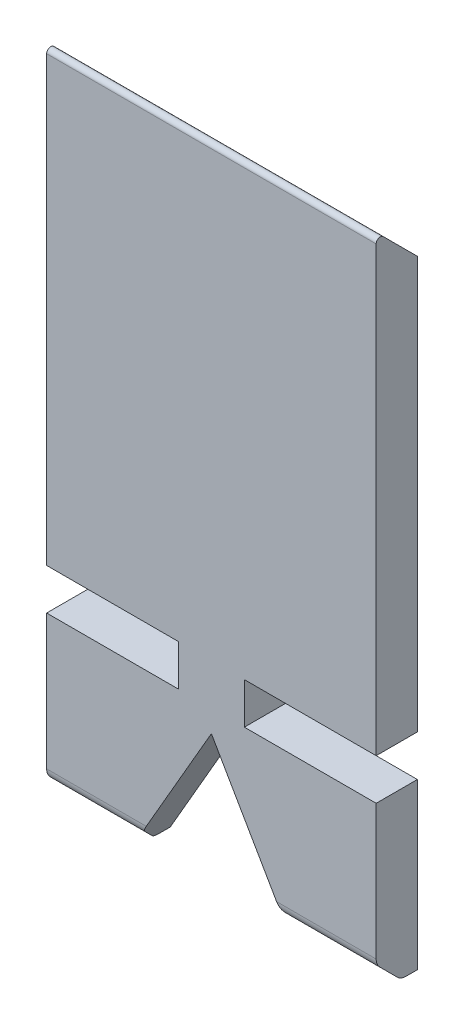
ISO-10303-21;
HEADER;
FILE_DESCRIPTION(('STEP AP214'),'2;1');
FILE_NAME('part.step','',(''),(''),'','','');
FILE_SCHEMA(('AUTOMOTIVE_DESIGN { 1 0 10303 214 1 1 1 1 }'));
ENDSEC;
DATA;
#1=APPLICATION_CONTEXT('core data for automotive mechanical design processes');
#2=APPLICATION_PROTOCOL_DEFINITION('international standard','automotive_design',2000,#1);
#3=PRODUCT_CONTEXT('',#1,'mechanical');
#4=PRODUCT('Part','Part','',(#3));
#5=PRODUCT_RELATED_PRODUCT_CATEGORY('part','',(#4));
#6=PRODUCT_DEFINITION_FORMATION('','',#4);
#7=PRODUCT_DEFINITION_CONTEXT('part definition',#1,'design');
#8=PRODUCT_DEFINITION('design','',#6,#7);
#9=PRODUCT_DEFINITION_SHAPE('','',#8);
#10=(LENGTH_UNIT() NAMED_UNIT(*) SI_UNIT(.MILLI.,.METRE.));
#11=(NAMED_UNIT(*) PLANE_ANGLE_UNIT() SI_UNIT($,.RADIAN.));
#12=(NAMED_UNIT(*) SI_UNIT($,.STERADIAN.) SOLID_ANGLE_UNIT());
#13=UNCERTAINTY_MEASURE_WITH_UNIT(LENGTH_MEASURE(1.E-05),#10,'distance_accuracy_value','');
#14=(GEOMETRIC_REPRESENTATION_CONTEXT(3) GLOBAL_UNCERTAINTY_ASSIGNED_CONTEXT((#13)) GLOBAL_UNIT_ASSIGNED_CONTEXT((#10,
#11,#12)) REPRESENTATION_CONTEXT('',''));
#15=CARTESIAN_POINT('',(0.,0.,0.));
#16=DIRECTION('',(0.,0.,1.));
#17=DIRECTION('',(1.,0.,0.));
#18=AXIS2_PLACEMENT_3D('',#15,#16,#17);
#19=CARTESIAN_POINT('',(0.,0.,10.));
#20=DIRECTION('',(1.,0.,0.));
#21=DIRECTION('',(0.,0.,-1.));
#22=AXIS2_PLACEMENT_3D('',#19,#20,#21);
#23=PLANE('',#22);
#24=DIRECTION('',(0.,-1.,0.));
#25=VECTOR('',#24,1.);
#26=CARTESIAN_POINT('',(0.,0.,0.));
#27=LINE('',#26,#25);
#28=CARTESIAN_POINT('',(0.,150.,0.));
#29=VERTEX_POINT('',#28);
#30=CARTESIAN_POINT('',(0.,50.,0.));
#31=VERTEX_POINT('',#30);
#32=EDGE_CURVE('E332',#29,#31,#27,.T.);
#33=ORIENTED_EDGE('',*,*,#32,.T.);
#34=DIRECTION('',(0.,0.,1.));
#35=VECTOR('',#34,1.);
#36=CARTESIAN_POINT('',(0.,50.,0.));
#37=LINE('',#36,#35);
#38=CARTESIAN_POINT('',(0.,50.,10.));
#39=VERTEX_POINT('',#38);
#40=EDGE_CURVE('E252',#31,#39,#37,.T.);
#41=ORIENTED_EDGE('',*,*,#40,.T.);
#42=DIRECTION('',(0.,-1.,0.));
#43=VECTOR('',#42,1.);
#44=CARTESIAN_POINT('',(0.,0.,10.));
#45=LINE('',#44,#43);
#46=CARTESIAN_POINT('',(0.,157.585786437627,10.));
#47=VERTEX_POINT('',#46);
#48=EDGE_CURVE('E321',#47,#39,#45,.T.);
#49=ORIENTED_EDGE('',*,*,#48,.F.);
#50=CARTESIAN_POINT('',(0.,157.585786437627,9.));
#51=DIRECTION('',(1.,0.,0.));
#52=DIRECTION('',(0.,0.,-1.));
#53=AXIS2_PLACEMENT_3D('',#50,#51,#52);
#54=CIRCLE('',#53,1.);
#55=CARTESIAN_POINT('',(0.,158.292893218813,8.29289321881344));
#56=VERTEX_POINT('',#55);
#57=EDGE_CURVE('E407',#47,#56,#54,.F.);
#58=ORIENTED_EDGE('',*,*,#57,.T.);
#59=DIRECTION('',(0.,-0.707106781186549,-0.707106781186547));
#60=VECTOR('',#59,1.);
#61=CARTESIAN_POINT('',(0.,160.,10.));
#62=LINE('',#61,#60);
#63=EDGE_CURVE('E351',#56,#29,#62,.T.);
#64=ORIENTED_EDGE('',*,*,#63,.T.);
#65=EDGE_LOOP('',(#33,#41,#49,#58,#64));
#66=FACE_BOUND('',#65,.T.);
#67=ADVANCED_FACE('F53',(#66),#23,.F.);
#68=CARTESIAN_POINT('',(0.,0.,10.));
#69=DIRECTION('',(0.,1.,0.));
#70=DIRECTION('',(0.,0.,1.));
#71=AXIS2_PLACEMENT_3D('',#68,#69,#70);
#72=PLANE('',#71);
#73=DIRECTION('',(1.,0.,0.));
#74=VECTOR('',#73,1.);
#75=CARTESIAN_POINT('',(0.,0.,2.75735931288071));
#76=LINE('',#75,#74);
#77=CARTESIAN_POINT('',(80.,0.,2.75735931288071));
#78=VERTEX_POINT('',#77);
#79=CARTESIAN_POINT('',(60.,0.,2.75735931288071));
#80=VERTEX_POINT('',#79);
#81=EDGE_CURVE('E371',#78,#80,#76,.F.);
#82=ORIENTED_EDGE('',*,*,#81,.T.);
#83=DIRECTION('',(0.,0.,1.));
#84=VECTOR('',#83,1.);
#85=CARTESIAN_POINT('',(60.,0.,0.));
#86=LINE('',#85,#84);
#87=CARTESIAN_POINT('',(60.,0.,0.));
#88=VERTEX_POINT('',#87);
#89=EDGE_CURVE('E236',#88,#80,#86,.T.);
#90=ORIENTED_EDGE('',*,*,#89,.F.);
#91=DIRECTION('',(1.,0.,0.));
#92=VECTOR('',#91,1.);
#93=CARTESIAN_POINT('',(0.,0.,0.));
#94=LINE('',#93,#92);
#95=CARTESIAN_POINT('',(80.,0.,0.));
#96=VERTEX_POINT('',#95);
#97=EDGE_CURVE('E226',#88,#96,#94,.T.);
#98=ORIENTED_EDGE('',*,*,#97,.T.);
#99=DIRECTION('',(0.,0.,-1.));
#100=VECTOR('',#99,1.);
#101=CARTESIAN_POINT('',(80.,0.,10.));
#102=LINE('',#101,#100);
#103=EDGE_CURVE('E331',#78,#96,#102,.T.);
#104=ORIENTED_EDGE('',*,*,#103,.F.);
#105=EDGE_LOOP('',(#82,#90,#98,#104));
#106=FACE_BOUND('',#105,.T.);
#107=ADVANCED_FACE('F492',(#106),#72,.F.);
#108=CARTESIAN_POINT('',(80.,0.,10.));
#109=DIRECTION('',(-1.,0.,0.));
#110=DIRECTION('',(0.,0.,1.));
#111=AXIS2_PLACEMENT_3D('',#108,#109,#110);
#112=PLANE('',#111);
#113=DIRECTION('',(0.,1.,0.));
#114=VECTOR('',#113,1.);
#115=CARTESIAN_POINT('',(80.,0.,0.));
#116=LINE('',#115,#114);
#117=CARTESIAN_POINT('',(80.,40.,0.));
#118=VERTEX_POINT('',#117);
#119=EDGE_CURVE('E340',#96,#118,#116,.T.);
#120=ORIENTED_EDGE('',*,*,#119,.T.);
#121=DIRECTION('',(0.,0.,1.));
#122=VECTOR('',#121,1.);
#123=CARTESIAN_POINT('',(80.,40.,0.));
#124=LINE('',#123,#122);
#125=CARTESIAN_POINT('',(80.,40.,10.));
#126=VERTEX_POINT('',#125);
#127=EDGE_CURVE('E286',#118,#126,#124,.T.);
#128=ORIENTED_EDGE('',*,*,#127,.T.);
#129=DIRECTION('',(0.,1.,0.));
#130=VECTOR('',#129,1.);
#131=CARTESIAN_POINT('',(80.,0.,10.));
#132=LINE('',#131,#130);
#133=CARTESIAN_POINT('',(80.,7.24264068711929,10.));
#134=VERTEX_POINT('',#133);
#135=EDGE_CURVE('E327',#134,#126,#132,.T.);
#136=ORIENTED_EDGE('',*,*,#135,.F.);
#137=CARTESIAN_POINT('',(80.,7.24264068711929,7.));
#138=DIRECTION('',(-1.,0.,0.));
#139=DIRECTION('',(0.,0.,1.));
#140=AXIS2_PLACEMENT_3D('',#137,#138,#139);
#141=CIRCLE('',#140,3.);
#142=CARTESIAN_POINT('',(80.,5.12132034355964,9.12132034355965));
#143=VERTEX_POINT('',#142);
#144=EDGE_CURVE('E391',#134,#143,#141,.F.);
#145=ORIENTED_EDGE('',*,*,#144,.T.);
#146=DIRECTION('',(0.,0.707106781186548,0.707106781186548));
#147=VECTOR('',#146,1.);
#148=CARTESIAN_POINT('',(80.,6.,10.));
#149=LINE('',#148,#147);
#150=CARTESIAN_POINT('',(80.,0.878679656440356,4.87867965644036));
#151=VERTEX_POINT('',#150);
#152=EDGE_CURVE('E362',#143,#151,#149,.F.);
#153=ORIENTED_EDGE('',*,*,#152,.T.);
#154=CARTESIAN_POINT('',(80.,3.,2.75735931288071));
#155=DIRECTION('',(-1.,0.,0.));
#156=DIRECTION('',(0.,0.,1.));
#157=AXIS2_PLACEMENT_3D('',#154,#155,#156);
#158=CIRCLE('',#157,3.);
#159=EDGE_CURVE('E383',#151,#78,#158,.F.);
#160=ORIENTED_EDGE('',*,*,#159,.T.);
#161=ORIENTED_EDGE('',*,*,#103,.T.);
#162=EDGE_LOOP('',(#120,#128,#136,#145,#153,#160,#161));
#163=FACE_BOUND('',#162,.T.);
#164=ADVANCED_FACE('F487',(#163),#112,.F.);
#165=CARTESIAN_POINT('',(0.,6.,10.));
#166=DIRECTION('',(0.,0.707106781186548,-0.707106781186548));
#167=DIRECTION('',(1.,0.,0.));
#168=AXIS2_PLACEMENT_3D('',#165,#166,#167);
#169=PLANE('',#168);
#170=DIRECTION('',(0.377964473009227,-0.654653670707977,-0.654653670707977));
#171=VECTOR('',#170,1.);
#172=CARTESIAN_POINT('',(48.4593414727391,19.9890069220189,23.9890069220189));
#173=LINE('',#172,#171);
#174=CARTESIAN_POINT('',(59.4926940638227,0.878679656440354,4.87867965644035));
#175=VERTEX_POINT('',#174);
#176=CARTESIAN_POINT('',(57.0432043210395,5.12132034355964,9.12132034355964));
#177=VERTEX_POINT('',#176);
#178=EDGE_CURVE('E314',#175,#177,#173,.F.);
#179=ORIENTED_EDGE('',*,*,#178,.F.);
#180=DIRECTION('',(-1.,0.,0.));
#181=VECTOR('',#180,1.);
#182=CARTESIAN_POINT('',(80.,0.878679656440357,4.87867965644036));
#183=LINE('',#182,#181);
#184=EDGE_CURVE('E378',#175,#151,#183,.F.);
#185=ORIENTED_EDGE('',*,*,#184,.T.);
#186=ORIENTED_EDGE('',*,*,#152,.F.);
#187=DIRECTION('',(1.,0.,0.));
#188=VECTOR('',#187,1.);
#189=CARTESIAN_POINT('',(0.,5.12132034355964,9.12132034355964));
#190=LINE('',#189,#188);
#191=EDGE_CURVE('E395',#143,#177,#190,.F.);
#192=ORIENTED_EDGE('',*,*,#191,.T.);
#193=EDGE_LOOP('',(#179,#185,#186,#192));
#194=FACE_BOUND('',#193,.T.);
#195=ADVANCED_FACE('F500',(#194),#169,.F.);
#196=CARTESIAN_POINT('',(0.,3.,2.75735931288071));
#197=DIRECTION('',(-1.,0.,0.));
#198=DIRECTION('',(0.,0.,1.));
#199=AXIS2_PLACEMENT_3D('',#196,#197,#198);
#200=CYLINDRICAL_SURFACE('',#199,3.);
#201=CARTESIAN_POINT('',(58.2679491924311,3.,2.75735931288071));
#202=DIRECTION('',(0.866025403784439,0.5,0.));
#203=DIRECTION('',(-0.5,0.866025403784439,0.));
#204=AXIS2_PLACEMENT_3D('',#201,#202,#203);
#205=ELLIPSE('',#204,3.46410161513775,3.);
#206=EDGE_CURVE('E317',#80,#175,#205,.F.);
#207=ORIENTED_EDGE('',*,*,#206,.F.);
#208=ORIENTED_EDGE('',*,*,#81,.F.);
#209=ORIENTED_EDGE('',*,*,#159,.F.);
#210=ORIENTED_EDGE('',*,*,#184,.F.);
#211=EDGE_LOOP('',(#207,#208,#209,#210));
#212=FACE_BOUND('',#211,.T.);
#213=ADVANCED_FACE('F495',(#212),#200,.T.);
#214=CARTESIAN_POINT('',(0.,7.24264068711929,7.));
#215=DIRECTION('',(1.,0.,0.));
#216=DIRECTION('',(0.,0.,-1.));
#217=AXIS2_PLACEMENT_3D('',#214,#215,#216);
#218=CYLINDRICAL_SURFACE('',#217,3.);
#219=CARTESIAN_POINT('',(55.8184594496479,7.24264068711929,7.));
#220=DIRECTION('',(0.866025403784439,0.5,0.));
#221=DIRECTION('',(0.5,-0.866025403784439,0.));
#222=AXIS2_PLACEMENT_3D('',#219,#220,#221);
#223=ELLIPSE('',#222,3.46410161513775,3.);
#224=CARTESIAN_POINT('',(55.8184594496479,7.24264068711929,10.));
#225=VERTEX_POINT('',#224);
#226=EDGE_CURVE('E13',#177,#225,#223,.F.);
#227=ORIENTED_EDGE('',*,*,#226,.F.);
#228=ORIENTED_EDGE('',*,*,#191,.F.);
#229=ORIENTED_EDGE('',*,*,#144,.F.);
#230=DIRECTION('',(-1.,0.,0.));
#231=VECTOR('',#230,1.);
#232=CARTESIAN_POINT('',(80.,7.24264068711929,10.));
#233=LINE('',#232,#231);
#234=EDGE_CURVE('E386',#225,#134,#233,.F.);
#235=ORIENTED_EDGE('',*,*,#234,.F.);
#236=EDGE_LOOP('',(#227,#228,#229,#235));
#237=FACE_BOUND('',#236,.T.);
#238=ADVANCED_FACE('F505',(#237),#218,.T.);
#239=CARTESIAN_POINT('',(0.,40.,10.));
#240=VERTEX_POINT('',#239);
#241=CARTESIAN_POINT('',(0.,7.24264068711929,10.));
#242=VERTEX_POINT('',#241);
#243=EDGE_CURVE('E326',#240,#242,#45,.T.);
#244=ORIENTED_EDGE('',*,*,#243,.F.);
#245=DIRECTION('',(0.,0.,1.));
#246=VECTOR('',#245,1.);
#247=CARTESIAN_POINT('',(0.,40.,0.));
#248=LINE('',#247,#246);
#249=CARTESIAN_POINT('',(0.,40.,0.));
#250=VERTEX_POINT('',#249);
#251=EDGE_CURVE('E242',#250,#240,#248,.T.);
#252=ORIENTED_EDGE('',*,*,#251,.F.);
#253=CARTESIAN_POINT('',(0.,0.,0.));
#254=VERTEX_POINT('',#253);
#255=EDGE_CURVE('E320',#250,#254,#27,.T.);
#256=ORIENTED_EDGE('',*,*,#255,.T.);
#257=DIRECTION('',(0.,0.,-1.));
#258=VECTOR('',#257,1.);
#259=CARTESIAN_POINT('',(0.,0.,10.));
#260=LINE('',#259,#258);
#261=CARTESIAN_POINT('',(0.,0.,2.75735931288071));
#262=VERTEX_POINT('',#261);
#263=EDGE_CURVE('E347',#262,#254,#260,.T.);
#264=ORIENTED_EDGE('',*,*,#263,.F.);
#265=CARTESIAN_POINT('',(0.,3.,2.75735931288071));
#266=DIRECTION('',(1.,0.,0.));
#267=DIRECTION('',(0.,0.,-1.));
#268=AXIS2_PLACEMENT_3D('',#265,#266,#267);
#269=CIRCLE('',#268,3.);
#270=CARTESIAN_POINT('',(0.,0.878679656440356,4.87867965644036));
#271=VERTEX_POINT('',#270);
#272=EDGE_CURVE('E375',#262,#271,#269,.F.);
#273=ORIENTED_EDGE('',*,*,#272,.T.);
#274=DIRECTION('',(0.,-0.707106781186548,-0.707106781186548));
#275=VECTOR('',#274,1.);
#276=CARTESIAN_POINT('',(0.,6.,10.));
#277=LINE('',#276,#275);
#278=CARTESIAN_POINT('',(0.,5.12132034355964,9.12132034355965));
#279=VERTEX_POINT('',#278);
#280=EDGE_CURVE('E366',#271,#279,#277,.F.);
#281=ORIENTED_EDGE('',*,*,#280,.T.);
#282=CARTESIAN_POINT('',(0.,7.24264068711929,7.));
#283=DIRECTION('',(1.,0.,0.));
#284=DIRECTION('',(0.,0.,-1.));
#285=AXIS2_PLACEMENT_3D('',#282,#283,#284);
#286=CIRCLE('',#285,3.);
#287=EDGE_CURVE('E399',#279,#242,#286,.F.);
#288=ORIENTED_EDGE('',*,*,#287,.T.);
#289=EDGE_LOOP('',(#244,#252,#256,#264,#273,#281,#288));
#290=FACE_BOUND('',#289,.T.);
#291=ADVANCED_FACE('F443',(#290),#23,.F.);
#292=CARTESIAN_POINT('',(20.,0.,0.));
#293=VERTEX_POINT('',#292);
#294=EDGE_CURVE('E336',#254,#293,#94,.T.);
#295=ORIENTED_EDGE('',*,*,#294,.T.);
#296=DIRECTION('',(0.,0.,1.));
#297=VECTOR('',#296,1.);
#298=CARTESIAN_POINT('',(20.,0.,0.));
#299=LINE('',#298,#297);
#300=CARTESIAN_POINT('',(20.,0.,2.75735931288071));
#301=VERTEX_POINT('',#300);
#302=EDGE_CURVE('E212',#293,#301,#299,.T.);
#303=ORIENTED_EDGE('',*,*,#302,.T.);
#304=EDGE_CURVE('E370',#301,#262,#76,.F.);
#305=ORIENTED_EDGE('',*,*,#304,.T.);
#306=ORIENTED_EDGE('',*,*,#263,.T.);
#307=EDGE_LOOP('',(#295,#303,#305,#306));
#308=FACE_BOUND('',#307,.T.);
#309=ADVANCED_FACE('F445',(#308),#72,.F.);
#310=CARTESIAN_POINT('',(80.,50.,10.));
#311=VERTEX_POINT('',#310);
#312=CARTESIAN_POINT('',(80.,157.585786437627,10.));
#313=VERTEX_POINT('',#312);
#314=EDGE_CURVE('E325',#311,#313,#132,.T.);
#315=ORIENTED_EDGE('',*,*,#314,.F.);
#316=DIRECTION('',(0.,0.,1.));
#317=VECTOR('',#316,1.);
#318=CARTESIAN_POINT('',(80.,50.,0.));
#319=LINE('',#318,#317);
#320=CARTESIAN_POINT('',(80.,50.,0.));
#321=VERTEX_POINT('',#320);
#322=EDGE_CURVE('E276',#321,#311,#319,.T.);
#323=ORIENTED_EDGE('',*,*,#322,.F.);
#324=CARTESIAN_POINT('',(80.,150.,0.));
#325=VERTEX_POINT('',#324);
#326=EDGE_CURVE('E339',#321,#325,#116,.T.);
#327=ORIENTED_EDGE('',*,*,#326,.T.);
#328=DIRECTION('',(0.,0.707106781186549,0.707106781186547));
#329=VECTOR('',#328,1.);
#330=CARTESIAN_POINT('',(80.,160.,10.));
#331=LINE('',#330,#329);
#332=CARTESIAN_POINT('',(80.,158.292893218813,8.29289321881344));
#333=VERTEX_POINT('',#332);
#334=EDGE_CURVE('E358',#325,#333,#331,.T.);
#335=ORIENTED_EDGE('',*,*,#334,.T.);
#336=CARTESIAN_POINT('',(80.,157.585786437627,9.));
#337=DIRECTION('',(-1.,0.,0.));
#338=DIRECTION('',(0.,0.,1.));
#339=AXIS2_PLACEMENT_3D('',#336,#337,#338);
#340=CIRCLE('',#339,1.);
#341=EDGE_CURVE('E413',#333,#313,#340,.F.);
#342=ORIENTED_EDGE('',*,*,#341,.T.);
#343=EDGE_LOOP('',(#315,#323,#327,#335,#342));
#344=FACE_BOUND('',#343,.T.);
#345=ADVANCED_FACE('F473',(#344),#112,.F.);
#346=CARTESIAN_POINT('',(0.,0.,10.));
#347=DIRECTION('',(0.,0.,-1.));
#348=DIRECTION('',(-1.,0.,0.));
#349=AXIS2_PLACEMENT_3D('',#346,#347,#348);
#350=PLANE('',#349);
#351=DIRECTION('',(-0.5,-0.866025403784439,0.));
#352=VECTOR('',#351,1.);
#353=CARTESIAN_POINT('',(40.,34.6410161513776,10.));
#354=LINE('',#353,#352);
#355=CARTESIAN_POINT('',(40.,34.6410161513776,10.));
#356=VERTEX_POINT('',#355);
#357=CARTESIAN_POINT('',(24.1815405503521,7.24264068711929,10.));
#358=VERTEX_POINT('',#357);
#359=EDGE_CURVE('E228',#356,#358,#354,.T.);
#360=ORIENTED_EDGE('',*,*,#359,.F.);
#361=DIRECTION('',(-0.5,0.866025403784439,0.));
#362=VECTOR('',#361,1.);
#363=CARTESIAN_POINT('',(60.,0.,10.));
#364=LINE('',#363,#362);
#365=EDGE_CURVE('E208',#225,#356,#364,.T.);
#366=ORIENTED_EDGE('',*,*,#365,.F.);
#367=ORIENTED_EDGE('',*,*,#234,.T.);
#368=ORIENTED_EDGE('',*,*,#135,.T.);
#369=DIRECTION('',(1.,0.,0.));
#370=VECTOR('',#369,1.);
#371=CARTESIAN_POINT('',(80.,40.,10.));
#372=LINE('',#371,#370);
#373=CARTESIAN_POINT('',(48.,40.,10.));
#374=VERTEX_POINT('',#373);
#375=EDGE_CURVE('E290',#374,#126,#372,.T.);
#376=ORIENTED_EDGE('',*,*,#375,.F.);
#377=DIRECTION('',(0.,-1.,0.));
#378=VECTOR('',#377,1.);
#379=CARTESIAN_POINT('',(48.,50.,10.));
#380=LINE('',#379,#378);
#381=CARTESIAN_POINT('',(48.,50.,10.));
#382=VERTEX_POINT('',#381);
#383=EDGE_CURVE('E293',#382,#374,#380,.T.);
#384=ORIENTED_EDGE('',*,*,#383,.F.);
#385=DIRECTION('',(-1.,0.,0.));
#386=VECTOR('',#385,1.);
#387=CARTESIAN_POINT('',(80.,50.,10.));
#388=LINE('',#387,#386);
#389=EDGE_CURVE('E256',#311,#382,#388,.T.);
#390=ORIENTED_EDGE('',*,*,#389,.F.);
#391=ORIENTED_EDGE('',*,*,#314,.T.);
#392=DIRECTION('',(-1.,0.,0.));
#393=VECTOR('',#392,1.);
#394=CARTESIAN_POINT('',(0.,157.585786437627,10.));
#395=LINE('',#394,#393);
#396=EDGE_CURVE('E403',#313,#47,#395,.T.);
#397=ORIENTED_EDGE('',*,*,#396,.T.);
#398=ORIENTED_EDGE('',*,*,#48,.T.);
#399=DIRECTION('',(-1.,0.,0.));
#400=VECTOR('',#399,1.);
#401=CARTESIAN_POINT('',(0.,50.,10.));
#402=LINE('',#401,#400);
#403=CARTESIAN_POINT('',(32.,50.,10.));
#404=VERTEX_POINT('',#403);
#405=EDGE_CURVE('E257',#404,#39,#402,.T.);
#406=ORIENTED_EDGE('',*,*,#405,.F.);
#407=DIRECTION('',(0.,1.,0.));
#408=VECTOR('',#407,1.);
#409=CARTESIAN_POINT('',(32.,50.,10.));
#410=LINE('',#409,#408);
#411=CARTESIAN_POINT('',(32.,40.,10.));
#412=VERTEX_POINT('',#411);
#413=EDGE_CURVE('E260',#412,#404,#410,.T.);
#414=ORIENTED_EDGE('',*,*,#413,.F.);
#415=DIRECTION('',(1.,0.,0.));
#416=VECTOR('',#415,1.);
#417=CARTESIAN_POINT('',(0.,40.,10.));
#418=LINE('',#417,#416);
#419=EDGE_CURVE('E234',#240,#412,#418,.T.);
#420=ORIENTED_EDGE('',*,*,#419,.F.);
#421=ORIENTED_EDGE('',*,*,#243,.T.);
#422=EDGE_CURVE('E387',#242,#358,#233,.F.);
#423=ORIENTED_EDGE('',*,*,#422,.T.);
#424=EDGE_LOOP('',(#360,#366,#367,#368,#376,#384,#390,#391,#397,#398,#406,#414,#420,#421,#423));
#425=FACE_BOUND('',#424,.T.);
#426=ADVANCED_FACE('F451',(#425),#350,.F.);
#427=CARTESIAN_POINT('',(0.,0.,0.));
#428=DIRECTION('',(0.,0.,-1.));
#429=DIRECTION('',(-1.,0.,0.));
#430=AXIS2_PLACEMENT_3D('',#427,#428,#429);
#431=PLANE('',#430);
#432=DIRECTION('',(-0.5,0.866025403784439,0.));
#433=VECTOR('',#432,1.);
#434=CARTESIAN_POINT('',(60.,0.,0.));
#435=LINE('',#434,#433);
#436=CARTESIAN_POINT('',(40.,34.6410161513776,0.));
#437=VERTEX_POINT('',#436);
#438=EDGE_CURVE('E205',#88,#437,#435,.T.);
#439=ORIENTED_EDGE('',*,*,#438,.T.);
#440=DIRECTION('',(-0.5,-0.866025403784439,0.));
#441=VECTOR('',#440,1.);
#442=CARTESIAN_POINT('',(40.,34.6410161513776,0.));
#443=LINE('',#442,#441);
#444=EDGE_CURVE('E213',#437,#293,#443,.T.);
#445=ORIENTED_EDGE('',*,*,#444,.T.);
#446=ORIENTED_EDGE('',*,*,#294,.F.);
#447=ORIENTED_EDGE('',*,*,#255,.F.);
#448=DIRECTION('',(1.,0.,0.));
#449=VECTOR('',#448,1.);
#450=CARTESIAN_POINT('',(0.,40.,0.));
#451=LINE('',#450,#449);
#452=CARTESIAN_POINT('',(32.,40.,0.));
#453=VERTEX_POINT('',#452);
#454=EDGE_CURVE('E261',#250,#453,#451,.T.);
#455=ORIENTED_EDGE('',*,*,#454,.T.);
#456=DIRECTION('',(0.,1.,0.));
#457=VECTOR('',#456,1.);
#458=CARTESIAN_POINT('',(32.,50.,0.));
#459=LINE('',#458,#457);
#460=CARTESIAN_POINT('',(32.,50.,0.));
#461=VERTEX_POINT('',#460);
#462=EDGE_CURVE('E69',#453,#461,#459,.T.);
#463=ORIENTED_EDGE('',*,*,#462,.T.);
#464=DIRECTION('',(-1.,0.,0.));
#465=VECTOR('',#464,1.);
#466=CARTESIAN_POINT('',(0.,50.,0.));
#467=LINE('',#466,#465);
#468=EDGE_CURVE('E245',#461,#31,#467,.T.);
#469=ORIENTED_EDGE('',*,*,#468,.T.);
#470=ORIENTED_EDGE('',*,*,#32,.F.);
#471=DIRECTION('',(1.,0.,0.));
#472=VECTOR('',#471,1.);
#473=CARTESIAN_POINT('',(80.,150.,0.));
#474=LINE('',#473,#472);
#475=EDGE_CURVE('E354',#29,#325,#474,.T.);
#476=ORIENTED_EDGE('',*,*,#475,.T.);
#477=ORIENTED_EDGE('',*,*,#326,.F.);
#478=DIRECTION('',(-1.,0.,0.));
#479=VECTOR('',#478,1.);
#480=CARTESIAN_POINT('',(80.,50.,0.));
#481=LINE('',#480,#479);
#482=CARTESIAN_POINT('',(48.,50.,0.));
#483=VERTEX_POINT('',#482);
#484=EDGE_CURVE('E294',#321,#483,#481,.T.);
#485=ORIENTED_EDGE('',*,*,#484,.T.);
#486=DIRECTION('',(0.,-1.,0.));
#487=VECTOR('',#486,1.);
#488=CARTESIAN_POINT('',(48.,50.,0.));
#489=LINE('',#488,#487);
#490=CARTESIAN_POINT('',(48.,40.,0.));
#491=VERTEX_POINT('',#490);
#492=EDGE_CURVE('E77',#483,#491,#489,.T.);
#493=ORIENTED_EDGE('',*,*,#492,.T.);
#494=DIRECTION('',(1.,0.,0.));
#495=VECTOR('',#494,1.);
#496=CARTESIAN_POINT('',(80.,40.,0.));
#497=LINE('',#496,#495);
#498=EDGE_CURVE('E279',#491,#118,#497,.T.);
#499=ORIENTED_EDGE('',*,*,#498,.T.);
#500=ORIENTED_EDGE('',*,*,#119,.F.);
#501=ORIENTED_EDGE('',*,*,#97,.F.);
#502=EDGE_LOOP('',(#439,#445,#446,#447,#455,#463,#469,#470,#476,#477,#485,#493,#499,#500,#501));
#503=FACE_BOUND('',#502,.T.);
#504=ADVANCED_FACE('F224',(#503),#431,.T.);
#505=CARTESIAN_POINT('',(0.,160.,10.));
#506=DIRECTION('',(0.,0.707106781186547,-0.707106781186549));
#507=DIRECTION('',(1.,0.,0.));
#508=AXIS2_PLACEMENT_3D('',#505,#506,#507);
#509=PLANE('',#508);
#510=ORIENTED_EDGE('',*,*,#63,.F.);
#511=DIRECTION('',(-1.,0.,0.));
#512=VECTOR('',#511,1.);
#513=CARTESIAN_POINT('',(80.,158.292893218813,8.29289321881344));
#514=LINE('',#513,#512);
#515=EDGE_CURVE('E410',#56,#333,#514,.F.);
#516=ORIENTED_EDGE('',*,*,#515,.T.);
#517=ORIENTED_EDGE('',*,*,#334,.F.);
#518=ORIENTED_EDGE('',*,*,#475,.F.);
#519=EDGE_LOOP('',(#510,#516,#517,#518));
#520=FACE_BOUND('',#519,.T.);
#521=ADVANCED_FACE('F466',(#520),#509,.T.);
#522=DIRECTION('',(0.377964473009227,0.654653670707977,0.654653670707977));
#523=VECTOR('',#522,1.);
#524=CARTESIAN_POINT('',(20.1120870986895,0.194140549803209,4.19414054980321));
#525=LINE('',#524,#523);
#526=CARTESIAN_POINT('',(22.9567956789605,5.12132034355964,9.12132034355964));
#527=VERTEX_POINT('',#526);
#528=CARTESIAN_POINT('',(20.5073059361773,0.878679656440356,4.87867965644036));
#529=VERTEX_POINT('',#528);
#530=EDGE_CURVE('E239',#527,#529,#525,.F.);
#531=ORIENTED_EDGE('',*,*,#530,.F.);
#532=EDGE_CURVE('E394',#527,#279,#190,.F.);
#533=ORIENTED_EDGE('',*,*,#532,.T.);
#534=ORIENTED_EDGE('',*,*,#280,.F.);
#535=EDGE_CURVE('E379',#271,#529,#183,.F.);
#536=ORIENTED_EDGE('',*,*,#535,.T.);
#537=EDGE_LOOP('',(#531,#533,#534,#536));
#538=FACE_BOUND('',#537,.T.);
#539=ADVANCED_FACE('F424',(#538),#169,.F.);
#540=CARTESIAN_POINT('',(21.7320508075689,3.,2.75735931288071));
#541=DIRECTION('',(-0.866025403784439,0.5,0.));
#542=DIRECTION('',(-0.5,-0.866025403784439,0.));
#543=AXIS2_PLACEMENT_3D('',#540,#541,#542);
#544=ELLIPSE('',#543,3.46410161513775,3.);
#545=EDGE_CURVE('E311',#529,#301,#544,.F.);
#546=ORIENTED_EDGE('',*,*,#545,.F.);
#547=ORIENTED_EDGE('',*,*,#535,.F.);
#548=ORIENTED_EDGE('',*,*,#272,.F.);
#549=ORIENTED_EDGE('',*,*,#304,.F.);
#550=EDGE_LOOP('',(#546,#547,#548,#549));
#551=FACE_BOUND('',#550,.T.);
#552=ADVANCED_FACE('F449',(#551),#200,.T.);
#553=CARTESIAN_POINT('',(24.1815405503521,7.24264068711929,7.));
#554=DIRECTION('',(-0.866025403784439,0.5,0.));
#555=DIRECTION('',(0.5,0.866025403784439,0.));
#556=AXIS2_PLACEMENT_3D('',#553,#554,#555);
#557=ELLIPSE('',#556,3.46410161513775,3.);
#558=EDGE_CURVE('E62',#358,#527,#557,.F.);
#559=ORIENTED_EDGE('',*,*,#558,.F.);
#560=ORIENTED_EDGE('',*,*,#422,.F.);
#561=ORIENTED_EDGE('',*,*,#287,.F.);
#562=ORIENTED_EDGE('',*,*,#532,.F.);
#563=EDGE_LOOP('',(#559,#560,#561,#562));
#564=FACE_BOUND('',#563,.T.);
#565=ADVANCED_FACE('F428',(#564),#218,.T.);
#566=CARTESIAN_POINT('',(0.,157.585786437627,9.));
#567=DIRECTION('',(1.,0.,0.));
#568=DIRECTION('',(0.,0.,-1.));
#569=AXIS2_PLACEMENT_3D('',#566,#567,#568);
#570=CYLINDRICAL_SURFACE('',#569,1.);
#571=ORIENTED_EDGE('',*,*,#341,.F.);
#572=ORIENTED_EDGE('',*,*,#515,.F.);
#573=ORIENTED_EDGE('',*,*,#57,.F.);
#574=ORIENTED_EDGE('',*,*,#396,.F.);
#575=EDGE_LOOP('',(#571,#572,#573,#574));
#576=FACE_BOUND('',#575,.T.);
#577=ADVANCED_FACE('F55',(#576),#570,.T.);
#578=CARTESIAN_POINT('',(60.,0.,0.));
#579=DIRECTION('',(0.866025403784439,0.5,0.));
#580=DIRECTION('',(-0.5,0.866025403784439,0.));
#581=AXIS2_PLACEMENT_3D('',#578,#579,#580);
#582=PLANE('',#581);
#583=ORIENTED_EDGE('',*,*,#206,.T.);
#584=ORIENTED_EDGE('',*,*,#178,.T.);
#585=ORIENTED_EDGE('',*,*,#226,.T.);
#586=ORIENTED_EDGE('',*,*,#365,.T.);
#587=DIRECTION('',(0.,0.,1.));
#588=VECTOR('',#587,1.);
#589=CARTESIAN_POINT('',(40.,34.6410161513776,0.));
#590=LINE('',#589,#588);
#591=EDGE_CURVE('E201',#437,#356,#590,.T.);
#592=ORIENTED_EDGE('',*,*,#591,.F.);
#593=ORIENTED_EDGE('',*,*,#438,.F.);
#594=ORIENTED_EDGE('',*,*,#89,.T.);
#595=EDGE_LOOP('',(#583,#584,#585,#586,#592,#593,#594));
#596=FACE_BOUND('',#595,.T.);
#597=ADVANCED_FACE('F203',(#596),#582,.F.);
#598=CARTESIAN_POINT('',(40.,34.6410161513776,0.));
#599=DIRECTION('',(-0.866025403784439,0.5,0.));
#600=DIRECTION('',(-0.5,-0.866025403784439,0.));
#601=AXIS2_PLACEMENT_3D('',#598,#599,#600);
#602=PLANE('',#601);
#603=ORIENTED_EDGE('',*,*,#545,.T.);
#604=ORIENTED_EDGE('',*,*,#302,.F.);
#605=ORIENTED_EDGE('',*,*,#444,.F.);
#606=ORIENTED_EDGE('',*,*,#591,.T.);
#607=ORIENTED_EDGE('',*,*,#359,.T.);
#608=ORIENTED_EDGE('',*,*,#558,.T.);
#609=ORIENTED_EDGE('',*,*,#530,.T.);
#610=EDGE_LOOP('',(#603,#604,#605,#606,#607,#608,#609));
#611=FACE_BOUND('',#610,.T.);
#612=ADVANCED_FACE('F216',(#611),#602,.F.);
#613=CARTESIAN_POINT('',(80.,40.,0.));
#614=DIRECTION('',(0.,-1.,0.));
#615=DIRECTION('',(1.,0.,0.));
#616=AXIS2_PLACEMENT_3D('',#613,#614,#615);
#617=PLANE('',#616);
#618=ORIENTED_EDGE('',*,*,#375,.T.);
#619=ORIENTED_EDGE('',*,*,#127,.F.);
#620=ORIENTED_EDGE('',*,*,#498,.F.);
#621=DIRECTION('',(0.,0.,1.));
#622=VECTOR('',#621,1.);
#623=CARTESIAN_POINT('',(48.,40.,0.));
#624=LINE('',#623,#622);
#625=EDGE_CURVE('E283',#491,#374,#624,.T.);
#626=ORIENTED_EDGE('',*,*,#625,.T.);
#627=EDGE_LOOP('',(#618,#619,#620,#626));
#628=FACE_BOUND('',#627,.T.);
#629=ADVANCED_FACE('F485',(#628),#617,.F.);
#630=CARTESIAN_POINT('',(48.,50.,0.));
#631=DIRECTION('',(-1.,0.,0.));
#632=DIRECTION('',(0.,0.,1.));
#633=AXIS2_PLACEMENT_3D('',#630,#631,#632);
#634=PLANE('',#633);
#635=ORIENTED_EDGE('',*,*,#383,.T.);
#636=ORIENTED_EDGE('',*,*,#625,.F.);
#637=ORIENTED_EDGE('',*,*,#492,.F.);
#638=DIRECTION('',(0.,0.,1.));
#639=VECTOR('',#638,1.);
#640=CARTESIAN_POINT('',(48.,50.,0.));
#641=LINE('',#640,#639);
#642=EDGE_CURVE('E280',#483,#382,#641,.T.);
#643=ORIENTED_EDGE('',*,*,#642,.T.);
#644=EDGE_LOOP('',(#635,#636,#637,#643));
#645=FACE_BOUND('',#644,.T.);
#646=ADVANCED_FACE('F480',(#645),#634,.F.);
#647=CARTESIAN_POINT('',(80.,50.,0.));
#648=DIRECTION('',(0.,1.,0.));
#649=DIRECTION('',(-1.,0.,0.));
#650=AXIS2_PLACEMENT_3D('',#647,#648,#649);
#651=PLANE('',#650);
#652=ORIENTED_EDGE('',*,*,#389,.T.);
#653=ORIENTED_EDGE('',*,*,#642,.F.);
#654=ORIENTED_EDGE('',*,*,#484,.F.);
#655=ORIENTED_EDGE('',*,*,#322,.T.);
#656=EDGE_LOOP('',(#652,#653,#654,#655));
#657=FACE_BOUND('',#656,.T.);
#658=ADVANCED_FACE('F477',(#657),#651,.F.);
#659=CARTESIAN_POINT('',(0.,50.,0.));
#660=DIRECTION('',(0.,1.,0.));
#661=DIRECTION('',(-1.,0.,0.));
#662=AXIS2_PLACEMENT_3D('',#659,#660,#661);
#663=PLANE('',#662);
#664=ORIENTED_EDGE('',*,*,#405,.T.);
#665=ORIENTED_EDGE('',*,*,#40,.F.);
#666=ORIENTED_EDGE('',*,*,#468,.F.);
#667=DIRECTION('',(0.,0.,1.));
#668=VECTOR('',#667,1.);
#669=CARTESIAN_POINT('',(32.,50.,0.));
#670=LINE('',#669,#668);
#671=EDGE_CURVE('E249',#461,#404,#670,.T.);
#672=ORIENTED_EDGE('',*,*,#671,.T.);
#673=EDGE_LOOP('',(#664,#665,#666,#672));
#674=FACE_BOUND('',#673,.T.);
#675=ADVANCED_FACE('F580',(#674),#663,.F.);
#676=CARTESIAN_POINT('',(32.,50.,0.));
#677=DIRECTION('',(1.,0.,0.));
#678=DIRECTION('',(0.,0.,-1.));
#679=AXIS2_PLACEMENT_3D('',#676,#677,#678);
#680=PLANE('',#679);
#681=ORIENTED_EDGE('',*,*,#413,.T.);
#682=ORIENTED_EDGE('',*,*,#671,.F.);
#683=ORIENTED_EDGE('',*,*,#462,.F.);
#684=DIRECTION('',(0.,0.,1.));
#685=VECTOR('',#684,1.);
#686=CARTESIAN_POINT('',(32.,40.,0.));
#687=LINE('',#686,#685);
#688=EDGE_CURVE('E246',#453,#412,#687,.T.);
#689=ORIENTED_EDGE('',*,*,#688,.T.);
#690=EDGE_LOOP('',(#681,#682,#683,#689));
#691=FACE_BOUND('',#690,.T.);
#692=ADVANCED_FACE('F588',(#691),#680,.F.);
#693=CARTESIAN_POINT('',(0.,40.,0.));
#694=DIRECTION('',(0.,-1.,0.));
#695=DIRECTION('',(1.,0.,0.));
#696=AXIS2_PLACEMENT_3D('',#693,#694,#695);
#697=PLANE('',#696);
#698=ORIENTED_EDGE('',*,*,#419,.T.);
#699=ORIENTED_EDGE('',*,*,#688,.F.);
#700=ORIENTED_EDGE('',*,*,#454,.F.);
#701=ORIENTED_EDGE('',*,*,#251,.T.);
#702=EDGE_LOOP('',(#698,#699,#700,#701));
#703=FACE_BOUND('',#702,.T.);
#704=ADVANCED_FACE('F456',(#703),#697,.F.);
#705=CLOSED_SHELL('',(#67,#107,#164,#195,#213,#238,#291,#309,#345,#426,#504,#521,#539,#552,#565,
#577,#597,#612,#629,#646,#658,#675,#692,#704));
#706=MANIFOLD_SOLID_BREP('B2',#705);
#707=ADVANCED_BREP_SHAPE_REPRESENTATION('',(#18,#706),#14);
#708=SHAPE_DEFINITION_REPRESENTATION(#9,#707);
ENDSEC;
END-ISO-10303-21;
